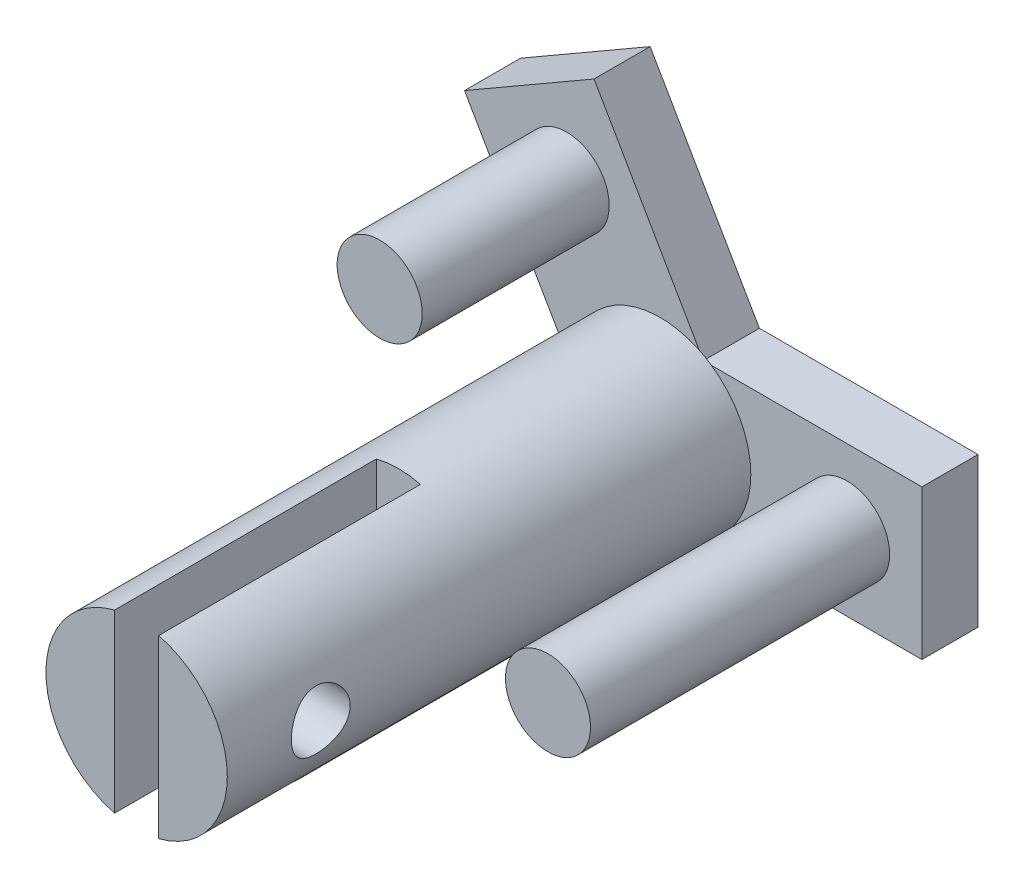
ISO-10303-21;
HEADER;
FILE_DESCRIPTION(('STEP AP214'),'2;1');
FILE_NAME('part.step','',(''),(''),'','','');
FILE_SCHEMA(('AUTOMOTIVE_DESIGN { 1 0 10303 214 1 1 1 1 }'));
ENDSEC;
DATA;
#1=APPLICATION_CONTEXT('core data for automotive mechanical design processes');
#2=APPLICATION_PROTOCOL_DEFINITION('international standard','automotive_design',2000,#1);
#3=PRODUCT_CONTEXT('',#1,'mechanical');
#4=PRODUCT('Part','Part','',(#3));
#5=PRODUCT_RELATED_PRODUCT_CATEGORY('part','',(#4));
#6=PRODUCT_DEFINITION_FORMATION('','',#4);
#7=PRODUCT_DEFINITION_CONTEXT('part definition',#1,'design');
#8=PRODUCT_DEFINITION('design','',#6,#7);
#9=PRODUCT_DEFINITION_SHAPE('','',#8);
#10=(LENGTH_UNIT() NAMED_UNIT(*) SI_UNIT(.MILLI.,.METRE.));
#11=(NAMED_UNIT(*) PLANE_ANGLE_UNIT() SI_UNIT($,.RADIAN.));
#12=(NAMED_UNIT(*) SI_UNIT($,.STERADIAN.) SOLID_ANGLE_UNIT());
#13=UNCERTAINTY_MEASURE_WITH_UNIT(LENGTH_MEASURE(1.E-05),#10,'distance_accuracy_value','');
#14=(GEOMETRIC_REPRESENTATION_CONTEXT(3) GLOBAL_UNCERTAINTY_ASSIGNED_CONTEXT((#13)) GLOBAL_UNIT_ASSIGNED_CONTEXT((#10,
#11,#12)) REPRESENTATION_CONTEXT('',''));
#15=CARTESIAN_POINT('',(0.,0.,0.));
#16=DIRECTION('',(0.,0.,1.));
#17=DIRECTION('',(1.,0.,0.));
#18=AXIS2_PLACEMENT_3D('',#15,#16,#17);
#19=CARTESIAN_POINT('',(-4.99999999999996,8.66025403784441,16.));
#20=DIRECTION('',(0.,0.,-1.));
#21=DIRECTION('',(-1.,0.,0.));
#22=AXIS2_PLACEMENT_3D('',#19,#20,#21);
#23=CYLINDRICAL_SURFACE('',#22,2.275);
#24=CARTESIAN_POINT('',(-4.99999999999996,8.66025403784441,0.));
#25=DIRECTION('',(0.,0.,1.));
#26=DIRECTION('',(1.,0.,0.));
#27=AXIS2_PLACEMENT_3D('',#24,#25,#26);
#28=CIRCLE('',#27,2.275);
#29=CARTESIAN_POINT('',(-2.72499999999996,8.66025403784441,0.));
#30=VERTEX_POINT('',#29);
#31=EDGE_CURVE('E474',#30,#30,#28,.T.);
#32=ORIENTED_EDGE('',*,*,#31,.T.);
#33=EDGE_LOOP('',(#32));
#34=FACE_BOUND('',#33,.T.);
#35=CARTESIAN_POINT('',(-4.99999999999996,8.66025403784441,10.));
#36=DIRECTION('',(0.,0.,1.));
#37=DIRECTION('',(1.,0.,0.));
#38=AXIS2_PLACEMENT_3D('',#35,#36,#37);
#39=CIRCLE('',#38,2.275);
#40=CARTESIAN_POINT('',(-2.72499999999995,8.66025403784441,10.));
#41=VERTEX_POINT('',#40);
#42=EDGE_CURVE('E461',#41,#41,#39,.T.);
#43=ORIENTED_EDGE('',*,*,#42,.F.);
#44=EDGE_LOOP('',(#43));
#45=FACE_BOUND('',#44,.T.);
#46=ADVANCED_FACE('F33',(#34,#45),#23,.T.);
#47=CARTESIAN_POINT('',(0.,0.,0.));
#48=DIRECTION('',(0.,0.,1.));
#49=DIRECTION('',(1.,0.,0.));
#50=AXIS2_PLACEMENT_3D('',#47,#48,#49);
#51=PLANE('',#50);
#52=CARTESIAN_POINT('',(0.,0.,0.));
#53=DIRECTION('',(0.,0.,1.));
#54=DIRECTION('',(1.,0.,0.));
#55=AXIS2_PLACEMENT_3D('',#52,#53,#54);
#56=CIRCLE('',#55,4.85);
#57=CARTESIAN_POINT('',(2.74271763038052,-3.99999999999998,0.));
#58=VERTEX_POINT('',#57);
#59=CARTESIAN_POINT('',(2.74271763038047,4.00000000000002,0.));
#60=VERTEX_POINT('',#59);
#61=EDGE_CURVE('E542',#58,#60,#56,.T.);
#62=ORIENTED_EDGE('',*,*,#61,.F.);
#63=DIRECTION('',(-1.,0.,0.));
#64=VECTOR('',#63,1.);
#65=CARTESIAN_POINT('',(2.30940107675848,-3.99999999999998,0.));
#66=LINE('',#65,#64);
#67=CARTESIAN_POINT('',(14.,-3.99999999999998,0.));
#68=VERTEX_POINT('',#67);
#69=EDGE_CURVE('E45',#68,#58,#66,.T.);
#70=ORIENTED_EDGE('',*,*,#69,.F.);
#71=DIRECTION('',(0.,-1.,0.));
#72=VECTOR('',#71,1.);
#73=CARTESIAN_POINT('',(14.,-3.99999999999998,0.));
#74=LINE('',#73,#72);
#75=CARTESIAN_POINT('',(14.,4.00000000000002,0.));
#76=VERTEX_POINT('',#75);
#77=EDGE_CURVE('E503',#76,#68,#74,.T.);
#78=ORIENTED_EDGE('',*,*,#77,.F.);
#79=DIRECTION('',(1.,0.,0.));
#80=VECTOR('',#79,1.);
#81=CARTESIAN_POINT('',(14.,4.00000000000002,0.));
#82=LINE('',#81,#80);
#83=EDGE_CURVE('E501',#60,#76,#82,.T.);
#84=ORIENTED_EDGE('',*,*,#83,.F.);
#85=EDGE_LOOP('',(#62,#70,#78,#84));
#86=FACE_BOUND('',#85,.T.);
#87=CARTESIAN_POINT('',(10.,0.,0.));
#88=DIRECTION('',(0.,0.,1.));
#89=DIRECTION('',(1.,0.,0.));
#90=AXIS2_PLACEMENT_3D('',#87,#88,#89);
#91=CIRCLE('',#90,2.275);
#92=CARTESIAN_POINT('',(12.275,0.,0.));
#93=VERTEX_POINT('',#92);
#94=EDGE_CURVE('E462',#93,#93,#91,.T.);
#95=ORIENTED_EDGE('',*,*,#94,.F.);
#96=EDGE_LOOP('',(#95));
#97=FACE_BOUND('',#96,.T.);
#98=ADVANCED_FACE('F232',(#86,#97),#51,.T.);
#99=CARTESIAN_POINT('',(-4.835460430328,-0.375263143317036,0.));
#100=VERTEX_POINT('',#99);
#101=CARTESIAN_POINT('',(2.09274279994746,-4.37526314331699,0.));
#102=VERTEX_POINT('',#101);
#103=EDGE_CURVE('E543',#100,#102,#56,.T.);
#104=ORIENTED_EDGE('',*,*,#103,.F.);
#105=DIRECTION('',(0.500000000000004,0.866025403784436,0.));
#106=VECTOR('',#105,1.);
#107=CARTESIAN_POINT('',(-4.61880215351696,0.,0.));
#108=LINE('',#107,#106);
#109=CARTESIAN_POINT('',(-10.4641016151378,-10.1243556529821,0.));
#110=VERTEX_POINT('',#109);
#111=EDGE_CURVE('E477',#110,#100,#108,.T.);
#112=ORIENTED_EDGE('',*,*,#111,.F.);
#113=DIRECTION('',(-0.866025403784438,0.500000000000001,0.));
#114=VECTOR('',#113,1.);
#115=CARTESIAN_POINT('',(-10.4641016151378,-10.1243556529821,0.));
#116=LINE('',#115,#114);
#117=CARTESIAN_POINT('',(-3.53589838486226,-14.1243556529821,0.));
#118=VERTEX_POINT('',#117);
#119=EDGE_CURVE('E170',#118,#110,#116,.T.);
#120=ORIENTED_EDGE('',*,*,#119,.F.);
#121=DIRECTION('',(-0.499999999999999,-0.866025403784439,0.));
#122=VECTOR('',#121,1.);
#123=CARTESIAN_POINT('',(-3.53589838486226,-14.1243556529821,0.));
#124=LINE('',#123,#122);
#125=EDGE_CURVE('E506',#102,#118,#124,.T.);
#126=ORIENTED_EDGE('',*,*,#125,.F.);
#127=EDGE_LOOP('',(#104,#112,#120,#126));
#128=FACE_BOUND('',#127,.T.);
#129=CARTESIAN_POINT('',(-5.00000000000001,-8.66025403784438,0.));
#130=DIRECTION('',(0.,0.,1.));
#131=DIRECTION('',(1.,0.,0.));
#132=AXIS2_PLACEMENT_3D('',#129,#130,#131);
#133=CIRCLE('',#132,2.275);
#134=CARTESIAN_POINT('',(-2.72500000000001,-8.66025403784438,0.));
#135=VERTEX_POINT('',#134);
#136=EDGE_CURVE('E469',#135,#135,#133,.T.);
#137=ORIENTED_EDGE('',*,*,#136,.F.);
#138=EDGE_LOOP('',(#137));
#139=FACE_BOUND('',#138,.T.);
#140=ADVANCED_FACE('F229',(#128,#139),#51,.T.);
#141=CARTESIAN_POINT('',(2.09274279994757,4.37526314331694,0.));
#142=VERTEX_POINT('',#141);
#143=CARTESIAN_POINT('',(-4.835460430328,0.375263143317045,0.));
#144=VERTEX_POINT('',#143);
#145=EDGE_CURVE('E533',#142,#144,#56,.T.);
#146=ORIENTED_EDGE('',*,*,#145,.F.);
#147=DIRECTION('',(0.499999999999997,-0.86602540378444,0.));
#148=VECTOR('',#147,1.);
#149=CARTESIAN_POINT('',(2.30940107675854,4.00000000000002,0.));
#150=LINE('',#149,#148);
#151=CARTESIAN_POINT('',(-3.53589838486217,14.1243556529822,0.));
#152=VERTEX_POINT('',#151);
#153=EDGE_CURVE('E498',#152,#142,#150,.T.);
#154=ORIENTED_EDGE('',*,*,#153,.F.);
#155=DIRECTION('',(0.866025403784442,0.499999999999994,0.));
#156=VECTOR('',#155,1.);
#157=CARTESIAN_POINT('',(-3.53589838486217,14.1243556529822,0.));
#158=LINE('',#157,#156);
#159=CARTESIAN_POINT('',(-10.4641016151377,10.1243556529822,0.));
#160=VERTEX_POINT('',#159);
#161=EDGE_CURVE('E496',#160,#152,#158,.T.);
#162=ORIENTED_EDGE('',*,*,#161,.F.);
#163=DIRECTION('',(-0.499999999999998,0.86602540378444,0.));
#164=VECTOR('',#163,1.);
#165=CARTESIAN_POINT('',(-10.4641016151377,10.1243556529822,0.));
#166=LINE('',#165,#164);
#167=EDGE_CURVE('E493',#144,#160,#166,.T.);
#168=ORIENTED_EDGE('',*,*,#167,.F.);
#169=EDGE_LOOP('',(#146,#154,#162,#168));
#170=FACE_BOUND('',#169,.T.);
#171=ORIENTED_EDGE('',*,*,#31,.F.);
#172=EDGE_LOOP('',(#171));
#173=FACE_BOUND('',#172,.T.);
#174=ADVANCED_FACE('F223',(#170,#173),#51,.T.);
#175=CARTESIAN_POINT('',(0.,0.,0.));
#176=DIRECTION('',(0.,0.,1.));
#177=DIRECTION('',(1.,0.,0.));
#178=AXIS2_PLACEMENT_3D('',#175,#176,#177);
#179=PLANE('',#178);
#180=CARTESIAN_POINT('',(2.30940107675848,-3.99999999999998,0.));
#181=VERTEX_POINT('',#180);
#182=EDGE_CURVE('E52',#181,#102,#124,.T.);
#183=ORIENTED_EDGE('',*,*,#182,.F.);
#184=EDGE_CURVE('E11',#58,#181,#66,.T.);
#185=ORIENTED_EDGE('',*,*,#184,.F.);
#186=EDGE_CURVE('E577',#102,#58,#56,.T.);
#187=ORIENTED_EDGE('',*,*,#186,.F.);
#188=EDGE_LOOP('',(#183,#185,#187));
#189=FACE_BOUND('',#188,.T.);
#190=ADVANCED_FACE('F220',(#189),#179,.F.);
#191=CARTESIAN_POINT('',(2.30940107675854,4.00000000000002,0.));
#192=VERTEX_POINT('',#191);
#193=EDGE_CURVE('E59',#192,#60,#82,.T.);
#194=ORIENTED_EDGE('',*,*,#193,.F.);
#195=EDGE_CURVE('E43',#142,#192,#150,.T.);
#196=ORIENTED_EDGE('',*,*,#195,.F.);
#197=EDGE_CURVE('E538',#60,#142,#56,.T.);
#198=ORIENTED_EDGE('',*,*,#197,.F.);
#199=EDGE_LOOP('',(#194,#196,#198));
#200=FACE_BOUND('',#199,.T.);
#201=ADVANCED_FACE('F222',(#200),#179,.F.);
#202=CARTESIAN_POINT('',(-4.61880215351696,0.,0.));
#203=VERTEX_POINT('',#202);
#204=EDGE_CURVE('E175',#100,#203,#108,.T.);
#205=ORIENTED_EDGE('',*,*,#204,.F.);
#206=EDGE_CURVE('E539',#144,#100,#56,.T.);
#207=ORIENTED_EDGE('',*,*,#206,.F.);
#208=EDGE_CURVE('E494',#203,#144,#166,.T.);
#209=ORIENTED_EDGE('',*,*,#208,.F.);
#210=EDGE_LOOP('',(#205,#207,#209));
#211=FACE_BOUND('',#210,.T.);
#212=ADVANCED_FACE('F224',(#211),#179,.F.);
#213=CARTESIAN_POINT('',(0.,0.,28.));
#214=DIRECTION('',(0.,0.,1.));
#215=DIRECTION('',(1.,0.,0.));
#216=AXIS2_PLACEMENT_3D('',#213,#214,#215);
#217=PLANE('',#216);
#218=DIRECTION('',(0.,1.,0.));
#219=VECTOR('',#218,1.);
#220=CARTESIAN_POINT('',(1.18,0.,28.));
#221=LINE('',#220,#219);
#222=CARTESIAN_POINT('',(1.18,-4.70426402320278,28.));
#223=VERTEX_POINT('',#222);
#224=CARTESIAN_POINT('',(1.18,4.70426402320278,28.));
#225=VERTEX_POINT('',#224);
#226=EDGE_CURVE('E549',#223,#225,#221,.T.);
#227=ORIENTED_EDGE('',*,*,#226,.F.);
#228=CARTESIAN_POINT('',(0.,0.,28.));
#229=DIRECTION('',(0.,0.,1.));
#230=DIRECTION('',(1.,0.,0.));
#231=AXIS2_PLACEMENT_3D('',#228,#229,#230);
#232=CIRCLE('',#231,4.85);
#233=EDGE_CURVE('E541',#223,#225,#232,.T.);
#234=ORIENTED_EDGE('',*,*,#233,.T.);
#235=EDGE_LOOP('',(#227,#234));
#236=FACE_BOUND('',#235,.T.);
#237=ADVANCED_FACE('F219',(#236),#217,.T.);
#238=CARTESIAN_POINT('',(0.,0.,28.));
#239=DIRECTION('',(0.,0.,-1.));
#240=DIRECTION('',(-1.,0.,0.));
#241=AXIS2_PLACEMENT_3D('',#238,#239,#240);
#242=CYLINDRICAL_SURFACE('',#241,4.85);
#243=CARTESIAN_POINT('',(4.85,0.,24.575));
#244=CARTESIAN_POINT('',(4.84999993999274,0.0860613830732849,24.5749999776443));
#245=CARTESIAN_POINT('',(4.84768797692763,0.172123855143719,24.567923054505));
#246=CARTESIAN_POINT('',(4.83869231009479,0.341721391598793,24.5398837385932));
#247=CARTESIAN_POINT('',(4.83200793016766,0.425256062988472,24.5189191982052));
#248=CARTESIAN_POINT('',(4.81499538643767,0.587328257188695,24.4638937369173));
#249=CARTESIAN_POINT('',(4.80467312842366,0.665873637216033,24.4298540344379));
#250=CARTESIAN_POINT('',(4.78144351151116,0.816141129596984,24.3497380637625));
#251=CARTESIAN_POINT('',(4.76853568447428,0.88786200284424,24.3036596153928));
#252=CARTESIAN_POINT('',(4.74102082057978,1.02481663295395,24.1991721471742));
#253=CARTESIAN_POINT('',(4.72637460295703,1.08979330196185,24.1404365238626));
#254=CARTESIAN_POINT('',(4.69725394763857,1.20916840795528,24.0129967946378));
#255=CARTESIAN_POINT('',(4.6827795458182,1.26356467099234,23.9442906451407));
#256=CARTESIAN_POINT('',(4.65521478332178,1.36167134861424,23.7965830616877));
#257=CARTESIAN_POINT('',(4.64217242957024,1.40505304964245,23.7173534805874));
#258=CARTESIAN_POINT('',(4.61954150583434,1.47776761507159,23.5522311044256));
#259=CARTESIAN_POINT('',(4.60995194305992,1.50710451861101,23.4663402333492));
#260=CARTESIAN_POINT('',(4.59572378237627,1.54994220106585,23.2932477660089));
#261=CARTESIAN_POINT('',(4.59093563203985,1.5639227243312,23.2061775473738));
#262=CARTESIAN_POINT('',(4.5864093591984,1.57715016707346,23.0308057720108));
#263=CARTESIAN_POINT('',(4.58666976921012,1.57640136797477,22.9425045805515));
#264=CARTESIAN_POINT('',(4.59207973567197,1.56056505311718,22.7712165484113));
#265=CARTESIAN_POINT('',(4.5970181630397,1.54609670160351,22.688164652457));
#266=CARTESIAN_POINT('',(4.61088329862707,1.50423945830718,22.5257378268348));
#267=CARTESIAN_POINT('',(4.61981046170313,1.47684909293972,22.4463633176583));
#268=CARTESIAN_POINT('',(4.64080236845623,1.40950675560717,22.292109174518));
#269=CARTESIAN_POINT('',(4.65291357569265,1.36936675830616,22.2173182220431));
#270=CARTESIAN_POINT('',(4.67888871441245,1.27779512119796,22.075334717169));
#271=CARTESIAN_POINT('',(4.69275313072169,1.2263603550687,22.0081442763616));
#272=CARTESIAN_POINT('',(4.72151002193061,1.11065843317809,21.8797808358616));
#273=CARTESIAN_POINT('',(4.73641945334077,1.04588298072314,21.8190688968181));
#274=CARTESIAN_POINT('',(4.76498542284939,0.906885663486573,21.7092526001727));
#275=CARTESIAN_POINT('',(4.7786418526477,0.83266298347777,21.6601492453535));
#276=CARTESIAN_POINT('',(4.803326836521,0.675937820633178,21.5745977479569));
#277=CARTESIAN_POINT('',(4.81433064352115,0.59336685571924,21.5382674326535));
#278=CARTESIAN_POINT('',(4.83229137819121,0.422843546115297,21.4801530491372));
#279=CARTESIAN_POINT('',(4.83924963702044,0.334892982084287,21.4583641958087));
#280=CARTESIAN_POINT('',(4.84811739218595,0.160014628798588,21.4307548483723));
#281=CARTESIAN_POINT('',(4.85022389972505,0.0731951265461602,21.4243108671587));
#282=CARTESIAN_POINT('',(4.84973823502258,-0.100298367270868,21.4258057357654));
#283=CARTESIAN_POINT('',(4.84714681059966,-0.186972379796403,21.4337422964854));
#284=CARTESIAN_POINT('',(4.83768628536478,-0.355257122864095,21.4632764740525));
#285=CARTESIAN_POINT('',(4.83093555837613,-0.436941457905801,21.4844963073738));
#286=CARTESIAN_POINT('',(4.81395617506734,-0.595562029954689,21.5395271221112));
#287=CARTESIAN_POINT('',(4.8037270802259,-0.672497666843099,21.5733396911574));
#288=CARTESIAN_POINT('',(4.78051007756817,-0.821624808160351,21.6535568773611));
#289=CARTESIAN_POINT('',(4.7674583913642,-0.893644999213463,21.7002609943806));
#290=CARTESIAN_POINT('',(4.74008153594588,-1.02903139988972,21.8045806004787));
#291=CARTESIAN_POINT('',(4.72575599632549,-1.09239507873259,21.8621992687882));
#292=CARTESIAN_POINT('',(4.69666751099177,-1.21150212548531,21.989645482941));
#293=CARTESIAN_POINT('',(4.68191224212086,-1.2668007036518,22.059891449696));
#294=CARTESIAN_POINT('',(4.65426950941093,-1.36487372585819,22.2089847254226));
#295=CARTESIAN_POINT('',(4.64138204034608,-1.40764820493901,22.2878320103278));
#296=CARTESIAN_POINT('',(4.61906826935161,-1.47922900451393,22.4518346750047));
#297=CARTESIAN_POINT('',(4.60963204334892,-1.50807545296881,22.5369711080406));
#298=CARTESIAN_POINT('',(4.59540168033587,-1.55090381098164,22.7112670487786));
#299=CARTESIAN_POINT('',(4.59060559112895,-1.56489197195528,22.8004248480746));
#300=CARTESIAN_POINT('',(4.58641285352548,-1.57713489362434,22.9755524697769));
#301=CARTESIAN_POINT('',(4.58676409728518,-1.57612423930785,23.061465500431));
#302=CARTESIAN_POINT('',(4.59220767559651,-1.5601916237418,23.2318309490479));
#303=CARTESIAN_POINT('',(4.59729975459124,-1.54527041234714,23.3162834454915));
#304=CARTESIAN_POINT('',(4.61146827360902,-1.50244870799193,23.4799013003918));
#305=CARTESIAN_POINT('',(4.62047511429538,-1.47477445180604,23.5591323613381));
#306=CARTESIAN_POINT('',(4.64143583559968,-1.40741318232295,23.7118886625843));
#307=CARTESIAN_POINT('',(4.65339034841661,-1.36772359163263,23.785412674417));
#308=CARTESIAN_POINT('',(4.67952224619182,-1.27552172426177,23.9279951177299));
#309=CARTESIAN_POINT('',(4.69377162874972,-1.22254304774947,23.9967386930898));
#310=CARTESIAN_POINT('',(4.72257410449796,-1.10606877673219,24.1245974359869));
#311=CARTESIAN_POINT('',(4.73712728059645,-1.04257027758586,24.1837099353097));
#312=CARTESIAN_POINT('',(4.76553109164182,-0.904090865217836,24.292783562664));
#313=CARTESIAN_POINT('',(4.77933709982762,-0.828777015184565,24.3423350018328));
#314=CARTESIAN_POINT('',(4.80410375188532,-0.670443266342961,24.4280148950541));
#315=CARTESIAN_POINT('',(4.81506529011746,-0.587425800883457,24.4641475697883));
#316=CARTESIAN_POINT('',(4.83234360342133,-0.421300936722196,24.5199772792117));
#317=CARTESIAN_POINT('',(4.83890433663051,-0.338512326358257,24.5405475862505));
#318=CARTESIAN_POINT('',(4.8477320423946,-0.170482432278024,24.5680572998041));
#319=CARTESIAN_POINT('',(4.85000005943576,-0.085241750315566,24.5750000221428));
#320=CARTESIAN_POINT('',(4.85,0.,24.575));
#321=B_SPLINE_CURVE_WITH_KNOTS('',3,(#243,#244,#245,#246,#247,#248,#249,#250,#251,#252,#253,
#254,#255,#256,#257,#258,#259,#260,#261,#262,#263,#264,#265,#266,#267,#268,#269,#270,#271,#272,
#273,#274,#275,#276,#277,#278,#279,#280,#281,#282,#283,#284,#285,#286,#287,#288,#289,#290,#291,
#292,#293,#294,#295,#296,#297,#298,#299,#300,#301,#302,#303,#304,#305,#306,#307,#308,#309,#310,
#311,#312,#313,#314,#315,#316,#317,#318,#319,#320),.UNSPECIFIED.,.T.,.F.,(4,2,2,2,2,2,2,2,2,2,2,
2,2,2,2,2,2,2,2,2,2,2,2,2,2,2,2,2,2,2,2,2,2,2,2,2,2,2,4),(0.,0.257870616986795,
0.515781121038953,0.773274843254618,1.03081522902019,1.29603225139865,1.5613037102967,
1.83374802682579,2.1061139440496,2.36970501483799,2.63321946780711,2.88538057201253,
3.13757043881046,3.39366711628082,3.64983476927684,3.91865366703719,4.18749577766434,
4.45875653384938,4.72992798299201,4.98987786843661,5.24978637858893,5.50261927256906,
5.7554840532694,6.0148059440487,6.27420348754539,6.54475427059145,6.81530429666181,
7.08507012136517,7.35472240087616,7.61121364063929,7.86769105492499,8.11978407535021,
8.37193121027123,8.63461169729193,8.89736483459948,9.16964813319629,9.44184571626815,
9.69732259059516,9.95273729533202),.UNSPECIFIED.);
#322=CARTESIAN_POINT('',(4.85,0.,24.575));
#323=VERTEX_POINT('',#322);
#324=EDGE_CURVE('E191',#323,#323,#321,.T.);
#325=ORIENTED_EDGE('',*,*,#324,.T.);
#326=EDGE_LOOP('',(#325));
#327=FACE_BOUND('',#326,.T.);
#328=CARTESIAN_POINT('',(-4.85,0.,24.575));
#329=CARTESIAN_POINT('',(-4.84999993999274,-0.0860613830732856,24.5749999776443));
#330=CARTESIAN_POINT('',(-4.84768797692763,-0.17212385514372,24.567923054505));
#331=CARTESIAN_POINT('',(-4.83869231009479,-0.341721391598794,24.5398837385932));
#332=CARTESIAN_POINT('',(-4.83200793016766,-0.425256062988473,24.5189191982052));
#333=CARTESIAN_POINT('',(-4.81499538643767,-0.587328257188696,24.4638937369173));
#334=CARTESIAN_POINT('',(-4.80467312842366,-0.665873637216034,24.4298540344379));
#335=CARTESIAN_POINT('',(-4.78144351151116,-0.816141129596986,24.3497380637625));
#336=CARTESIAN_POINT('',(-4.76853568447428,-0.887862002844242,24.3036596153928));
#337=CARTESIAN_POINT('',(-4.74102082057978,-1.02481663295395,24.1991721471742));
#338=CARTESIAN_POINT('',(-4.72637460295703,-1.08979330196185,24.1404365238626));
#339=CARTESIAN_POINT('',(-4.69725394763857,-1.20916840795528,24.0129967946378));
#340=CARTESIAN_POINT('',(-4.6827795458182,-1.26356467099235,23.9442906451407));
#341=CARTESIAN_POINT('',(-4.65521478332178,-1.36167134861424,23.7965830616877));
#342=CARTESIAN_POINT('',(-4.64217242957024,-1.40505304964245,23.7173534805874));
#343=CARTESIAN_POINT('',(-4.61954150583434,-1.47776761507159,23.5522311044256));
#344=CARTESIAN_POINT('',(-4.60995194305992,-1.50710451861102,23.4663402333492));
#345=CARTESIAN_POINT('',(-4.59572378237627,-1.54994220106585,23.2932477660089));
#346=CARTESIAN_POINT('',(-4.59093563203984,-1.5639227243312,23.2061775473738));
#347=CARTESIAN_POINT('',(-4.5864093591984,-1.57715016707346,23.0308057720108));
#348=CARTESIAN_POINT('',(-4.58666976921012,-1.57640136797477,22.9425045805516));
#349=CARTESIAN_POINT('',(-4.59207973567197,-1.56056505311718,22.7712165484113));
#350=CARTESIAN_POINT('',(-4.5970181630397,-1.54609670160351,22.688164652457));
#351=CARTESIAN_POINT('',(-4.61088329862707,-1.50423945830718,22.5257378268348));
#352=CARTESIAN_POINT('',(-4.61981046170313,-1.47684909293972,22.4463633176583));
#353=CARTESIAN_POINT('',(-4.64080236845623,-1.40950675560717,22.292109174518));
#354=CARTESIAN_POINT('',(-4.65291357569265,-1.36936675830616,22.2173182220431));
#355=CARTESIAN_POINT('',(-4.67888871441245,-1.27779512119796,22.075334717169));
#356=CARTESIAN_POINT('',(-4.69275313072169,-1.2263603550687,22.0081442763617));
#357=CARTESIAN_POINT('',(-4.72151002193061,-1.11065843317809,21.8797808358616));
#358=CARTESIAN_POINT('',(-4.73641945334077,-1.04588298072315,21.8190688968181));
#359=CARTESIAN_POINT('',(-4.76498542284939,-0.906885663486577,21.7092526001727));
#360=CARTESIAN_POINT('',(-4.7786418526477,-0.832662983477775,21.6601492453535));
#361=CARTESIAN_POINT('',(-4.80332683652099,-0.675937820633183,21.5745977479569));
#362=CARTESIAN_POINT('',(-4.81433064352115,-0.593366855719244,21.5382674326535));
#363=CARTESIAN_POINT('',(-4.83229137819122,-0.4228435461153,21.4801530491372));
#364=CARTESIAN_POINT('',(-4.83924963702044,-0.33489298208429,21.4583641958087));
#365=CARTESIAN_POINT('',(-4.84811739218595,-0.16001462879859,21.4307548483723));
#366=CARTESIAN_POINT('',(-4.85022389972505,-0.0731951265461626,21.4243108671587));
#367=CARTESIAN_POINT('',(-4.84973823502258,0.100298367270866,21.4258057357654));
#368=CARTESIAN_POINT('',(-4.84714681059966,0.1869723797964,21.4337422964854));
#369=CARTESIAN_POINT('',(-4.83768628536478,0.355257122864093,21.4632764740525));
#370=CARTESIAN_POINT('',(-4.83093555837613,0.436941457905799,21.4844963073738));
#371=CARTESIAN_POINT('',(-4.81395617506734,0.595562029954686,21.5395271221112));
#372=CARTESIAN_POINT('',(-4.8037270802259,0.672497666843097,21.5733396911574));
#373=CARTESIAN_POINT('',(-4.78051007756817,0.821624808160349,21.6535568773611));
#374=CARTESIAN_POINT('',(-4.7674583913642,0.893644999213462,21.7002609943806));
#375=CARTESIAN_POINT('',(-4.74008153594588,1.02903139988972,21.8045806004787));
#376=CARTESIAN_POINT('',(-4.72575599632549,1.09239507873259,21.8621992687882));
#377=CARTESIAN_POINT('',(-4.69666751099177,1.21150212548531,21.989645482941));
#378=CARTESIAN_POINT('',(-4.68191224212086,1.2668007036518,22.059891449696));
#379=CARTESIAN_POINT('',(-4.65426950941093,1.36487372585819,22.2089847254226));
#380=CARTESIAN_POINT('',(-4.64138204034608,1.40764820493901,22.2878320103278));
#381=CARTESIAN_POINT('',(-4.61906826935161,1.47922900451393,22.4518346750047));
#382=CARTESIAN_POINT('',(-4.60963204334892,1.50807545296881,22.5369711080406));
#383=CARTESIAN_POINT('',(-4.59540168033587,1.55090381098163,22.7112670487786));
#384=CARTESIAN_POINT('',(-4.59060559112895,1.56489197195528,22.8004248480746));
#385=CARTESIAN_POINT('',(-4.58641285352548,1.57713489362434,22.9755524697769));
#386=CARTESIAN_POINT('',(-4.58676409728518,1.57612423930785,23.061465500431));
#387=CARTESIAN_POINT('',(-4.59220767559651,1.56019162374179,23.2318309490479));
#388=CARTESIAN_POINT('',(-4.59729975459124,1.54527041234713,23.3162834454915));
#389=CARTESIAN_POINT('',(-4.61146827360902,1.50244870799193,23.4799013003918));
#390=CARTESIAN_POINT('',(-4.62047511429538,1.47477445180603,23.5591323613381));
#391=CARTESIAN_POINT('',(-4.64143583559968,1.40741318232295,23.7118886625843));
#392=CARTESIAN_POINT('',(-4.65339034841661,1.36772359163262,23.785412674417));
#393=CARTESIAN_POINT('',(-4.67952224619182,1.27552172426177,23.9279951177299));
#394=CARTESIAN_POINT('',(-4.69377162874972,1.22254304774947,23.9967386930898));
#395=CARTESIAN_POINT('',(-4.72257410449796,1.10606877673219,24.1245974359869));
#396=CARTESIAN_POINT('',(-4.73712728059645,1.04257027758586,24.1837099353097));
#397=CARTESIAN_POINT('',(-4.76553109164182,0.904090865217834,24.292783562664));
#398=CARTESIAN_POINT('',(-4.77933709982763,0.828777015184563,24.3423350018328));
#399=CARTESIAN_POINT('',(-4.80410375188532,0.67044326634296,24.4280148950541));
#400=CARTESIAN_POINT('',(-4.81506529011746,0.587425800883456,24.4641475697883));
#401=CARTESIAN_POINT('',(-4.83234360342133,0.421300936722194,24.5199772792117));
#402=CARTESIAN_POINT('',(-4.83890433663051,0.338512326358255,24.5405475862505));
#403=CARTESIAN_POINT('',(-4.8477320423946,0.170482432278022,24.5680572998041));
#404=CARTESIAN_POINT('',(-4.85000005943576,0.0852417503155648,24.5750000221428));
#405=CARTESIAN_POINT('',(-4.85,0.,24.575));
#406=B_SPLINE_CURVE_WITH_KNOTS('',3,(#328,#329,#330,#331,#332,#333,#334,#335,#336,#337,#338,
#339,#340,#341,#342,#343,#344,#345,#346,#347,#348,#349,#350,#351,#352,#353,#354,#355,#356,#357,
#358,#359,#360,#361,#362,#363,#364,#365,#366,#367,#368,#369,#370,#371,#372,#373,#374,#375,#376,
#377,#378,#379,#380,#381,#382,#383,#384,#385,#386,#387,#388,#389,#390,#391,#392,#393,#394,#395,
#396,#397,#398,#399,#400,#401,#402,#403,#404,#405),.UNSPECIFIED.,.T.,.F.,(4,2,2,2,2,2,2,2,2,2,2,
2,2,2,2,2,2,2,2,2,2,2,2,2,2,2,2,2,2,2,2,2,2,2,2,2,2,2,4),(0.,0.257870616986795,
0.515781121038953,0.773274843254619,1.03081522902019,1.29603225139865,1.5613037102967,
1.83374802682578,2.1061139440496,2.36970501483799,2.63321946780711,2.88538057201253,
3.13757043881046,3.39366711628082,3.64983476927684,3.91865366703718,4.18749577766434,
4.45875653384938,4.72992798299201,4.98987786843661,5.24978637858893,5.50261927256906,
5.7554840532694,6.01480594404871,6.27420348754539,6.54475427059145,6.81530429666181,
7.08507012136517,7.35472240087616,7.61121364063929,7.86769105492499,8.11978407535021,
8.37193121027123,8.63461169729193,8.89736483459948,9.16964813319629,9.44184571626815,
9.69732259059516,9.95273729533202),.UNSPECIFIED.);
#407=CARTESIAN_POINT('',(-4.85,0.,24.575));
#408=VERTEX_POINT('',#407);
#409=EDGE_CURVE('E185',#408,#408,#406,.T.);
#410=ORIENTED_EDGE('',*,*,#409,.T.);
#411=EDGE_LOOP('',(#410));
#412=FACE_BOUND('',#411,.T.);
#413=CARTESIAN_POINT('',(0.,0.,14.));
#414=DIRECTION('',(0.,0.,-1.));
#415=DIRECTION('',(-1.,0.,0.));
#416=AXIS2_PLACEMENT_3D('',#413,#414,#415);
#417=CIRCLE('',#416,4.85);
#418=CARTESIAN_POINT('',(-1.18,4.70426402320278,14.));
#419=VERTEX_POINT('',#418);
#420=CARTESIAN_POINT('',(1.18,4.70426402320278,14.));
#421=VERTEX_POINT('',#420);
#422=EDGE_CURVE('E553',#419,#421,#417,.T.);
#423=ORIENTED_EDGE('',*,*,#422,.T.);
#424=DIRECTION('',(0.,0.,-1.));
#425=VECTOR('',#424,1.);
#426=CARTESIAN_POINT('',(1.18,4.70426402320278,28.));
#427=LINE('',#426,#425);
#428=EDGE_CURVE('E580',#421,#225,#427,.F.);
#429=ORIENTED_EDGE('',*,*,#428,.T.);
#430=ORIENTED_EDGE('',*,*,#233,.F.);
#431=DIRECTION('',(0.,0.,-1.));
#432=VECTOR('',#431,1.);
#433=CARTESIAN_POINT('',(1.18,-4.70426402320278,28.));
#434=LINE('',#433,#432);
#435=CARTESIAN_POINT('',(1.18,-4.70426402320278,14.));
#436=VERTEX_POINT('',#435);
#437=EDGE_CURVE('E579',#223,#436,#434,.T.);
#438=ORIENTED_EDGE('',*,*,#437,.T.);
#439=CARTESIAN_POINT('',(-1.18,-4.70426402320278,14.));
#440=VERTEX_POINT('',#439);
#441=EDGE_CURVE('E551',#436,#440,#417,.T.);
#442=ORIENTED_EDGE('',*,*,#441,.T.);
#443=DIRECTION('',(0.,0.,-1.));
#444=VECTOR('',#443,1.);
#445=CARTESIAN_POINT('',(-1.18,-4.70426402320278,28.));
#446=LINE('',#445,#444);
#447=CARTESIAN_POINT('',(-1.18,-4.70426402320278,28.));
#448=VERTEX_POINT('',#447);
#449=EDGE_CURVE('E586',#440,#448,#446,.F.);
#450=ORIENTED_EDGE('',*,*,#449,.T.);
#451=CARTESIAN_POINT('',(-1.18,4.70426402320278,28.));
#452=VERTEX_POINT('',#451);
#453=EDGE_CURVE('E550',#452,#448,#232,.T.);
#454=ORIENTED_EDGE('',*,*,#453,.F.);
#455=DIRECTION('',(0.,0.,-1.));
#456=VECTOR('',#455,1.);
#457=CARTESIAN_POINT('',(-1.18,4.70426402320278,28.));
#458=LINE('',#457,#456);
#459=EDGE_CURVE('E582',#452,#419,#458,.T.);
#460=ORIENTED_EDGE('',*,*,#459,.T.);
#461=EDGE_LOOP('',(#423,#429,#430,#438,#442,#450,#454,#460));
#462=FACE_BOUND('',#461,.T.);
#463=ORIENTED_EDGE('',*,*,#197,.T.);
#464=ORIENTED_EDGE('',*,*,#145,.T.);
#465=ORIENTED_EDGE('',*,*,#206,.T.);
#466=ORIENTED_EDGE('',*,*,#103,.T.);
#467=ORIENTED_EDGE('',*,*,#186,.T.);
#468=ORIENTED_EDGE('',*,*,#61,.T.);
#469=EDGE_LOOP('',(#463,#464,#465,#466,#467,#468));
#470=FACE_BOUND('',#469,.T.);
#471=ADVANCED_FACE('F35',(#327,#412,#462,#470),#242,.T.);
#472=DIRECTION('',(0.,-1.,0.));
#473=VECTOR('',#472,1.);
#474=CARTESIAN_POINT('',(-1.18,0.,28.));
#475=LINE('',#474,#473);
#476=EDGE_CURVE('E547',#452,#448,#475,.T.);
#477=ORIENTED_EDGE('',*,*,#476,.F.);
#478=ORIENTED_EDGE('',*,*,#453,.T.);
#479=EDGE_LOOP('',(#477,#478));
#480=FACE_BOUND('',#479,.T.);
#481=ADVANCED_FACE('F208',(#480),#217,.T.);
#482=CARTESIAN_POINT('',(0.,0.,14.));
#483=DIRECTION('',(0.,0.,-1.));
#484=DIRECTION('',(-1.,0.,0.));
#485=AXIS2_PLACEMENT_3D('',#482,#483,#484);
#486=PLANE('',#485);
#487=DIRECTION('',(0.,-1.,0.));
#488=VECTOR('',#487,1.);
#489=CARTESIAN_POINT('',(-1.18,-5.,14.));
#490=LINE('',#489,#488);
#491=EDGE_CURVE('E588',#419,#440,#490,.T.);
#492=ORIENTED_EDGE('',*,*,#491,.T.);
#493=ORIENTED_EDGE('',*,*,#441,.F.);
#494=DIRECTION('',(0.,1.,0.));
#495=VECTOR('',#494,1.);
#496=CARTESIAN_POINT('',(1.18,-5.,14.));
#497=LINE('',#496,#495);
#498=EDGE_CURVE('E590',#436,#421,#497,.T.);
#499=ORIENTED_EDGE('',*,*,#498,.T.);
#500=ORIENTED_EDGE('',*,*,#422,.F.);
#501=EDGE_LOOP('',(#492,#493,#499,#500));
#502=FACE_BOUND('',#501,.T.);
#503=ADVANCED_FACE('F203',(#502),#486,.F.);
#504=CARTESIAN_POINT('',(1.18,-5.,14.));
#505=DIRECTION('',(1.,0.,0.));
#506=DIRECTION('',(0.,0.,-1.));
#507=AXIS2_PLACEMENT_3D('',#504,#505,#506);
#508=PLANE('',#507);
#509=CARTESIAN_POINT('',(1.18,0.,23.));
#510=DIRECTION('',(1.,0.,0.));
#511=DIRECTION('',(0.,0.,-1.));
#512=AXIS2_PLACEMENT_3D('',#509,#510,#511);
#513=CIRCLE('',#512,1.575);
#514=CARTESIAN_POINT('',(1.18,0.,21.425));
#515=VERTEX_POINT('',#514);
#516=EDGE_CURVE('E178',#515,#515,#513,.T.);
#517=ORIENTED_EDGE('',*,*,#516,.T.);
#518=EDGE_LOOP('',(#517));
#519=FACE_BOUND('',#518,.T.);
#520=ORIENTED_EDGE('',*,*,#226,.T.);
#521=ORIENTED_EDGE('',*,*,#428,.F.);
#522=ORIENTED_EDGE('',*,*,#498,.F.);
#523=ORIENTED_EDGE('',*,*,#437,.F.);
#524=EDGE_LOOP('',(#520,#521,#522,#523));
#525=FACE_BOUND('',#524,.T.);
#526=ADVANCED_FACE('F207',(#519,#525),#508,.F.);
#527=CARTESIAN_POINT('',(-1.18,-5.,14.));
#528=DIRECTION('',(-1.,0.,0.));
#529=DIRECTION('',(0.,0.,1.));
#530=AXIS2_PLACEMENT_3D('',#527,#528,#529);
#531=PLANE('',#530);
#532=CARTESIAN_POINT('',(-1.18,0.,23.));
#533=DIRECTION('',(-1.,0.,0.));
#534=DIRECTION('',(0.,0.,1.));
#535=AXIS2_PLACEMENT_3D('',#532,#533,#534);
#536=CIRCLE('',#535,1.575);
#537=CARTESIAN_POINT('',(-1.18,0.,24.575));
#538=VERTEX_POINT('',#537);
#539=EDGE_CURVE('E38',#538,#538,#536,.T.);
#540=ORIENTED_EDGE('',*,*,#539,.T.);
#541=EDGE_LOOP('',(#540));
#542=FACE_BOUND('',#541,.T.);
#543=ORIENTED_EDGE('',*,*,#476,.T.);
#544=ORIENTED_EDGE('',*,*,#449,.F.);
#545=ORIENTED_EDGE('',*,*,#491,.F.);
#546=ORIENTED_EDGE('',*,*,#459,.F.);
#547=EDGE_LOOP('',(#543,#544,#545,#546));
#548=FACE_BOUND('',#547,.T.);
#549=ADVANCED_FACE('F210',(#542,#548),#531,.F.);
#550=CARTESIAN_POINT('',(4.85,0.,23.));
#551=DIRECTION('',(-1.,0.,0.));
#552=DIRECTION('',(0.,0.,1.));
#553=AXIS2_PLACEMENT_3D('',#550,#551,#552);
#554=CYLINDRICAL_SURFACE('',#553,1.575);
#555=ORIENTED_EDGE('',*,*,#539,.F.);
#556=EDGE_LOOP('',(#555));
#557=FACE_BOUND('',#556,.T.);
#558=ORIENTED_EDGE('',*,*,#409,.F.);
#559=EDGE_LOOP('',(#558));
#560=FACE_BOUND('',#559,.T.);
#561=ADVANCED_FACE('F200',(#557,#560),#554,.F.);
#562=ORIENTED_EDGE('',*,*,#516,.F.);
#563=EDGE_LOOP('',(#562));
#564=FACE_BOUND('',#563,.T.);
#565=ORIENTED_EDGE('',*,*,#324,.F.);
#566=EDGE_LOOP('',(#565));
#567=FACE_BOUND('',#566,.T.);
#568=ADVANCED_FACE('F195',(#564,#567),#554,.F.);
#569=CARTESIAN_POINT('',(-4.61880215351696,0.,-3.));
#570=DIRECTION('',(0.866025403784436,-0.500000000000004,0.));
#571=DIRECTION('',(0.500000000000004,0.866025403784436,0.));
#572=AXIS2_PLACEMENT_3D('',#569,#570,#571);
#573=PLANE('',#572);
#574=ORIENTED_EDGE('',*,*,#111,.T.);
#575=ORIENTED_EDGE('',*,*,#204,.T.);
#576=DIRECTION('',(0.,0.,1.));
#577=VECTOR('',#576,1.);
#578=CARTESIAN_POINT('',(-4.61880215351696,0.,-3.));
#579=LINE('',#578,#577);
#580=CARTESIAN_POINT('',(-4.61880215351696,0.,-3.));
#581=VERTEX_POINT('',#580);
#582=EDGE_CURVE('E155',#581,#203,#579,.T.);
#583=ORIENTED_EDGE('',*,*,#582,.F.);
#584=DIRECTION('',(0.500000000000004,0.866025403784436,0.));
#585=VECTOR('',#584,1.);
#586=CARTESIAN_POINT('',(-4.61880215351696,0.,-3.));
#587=LINE('',#586,#585);
#588=CARTESIAN_POINT('',(-10.4641016151378,-10.1243556529821,-3.));
#589=VERTEX_POINT('',#588);
#590=EDGE_CURVE('E161',#589,#581,#587,.T.);
#591=ORIENTED_EDGE('',*,*,#590,.F.);
#592=DIRECTION('',(0.,0.,1.));
#593=VECTOR('',#592,1.);
#594=CARTESIAN_POINT('',(-10.4641016151378,-10.1243556529821,-3.));
#595=LINE('',#594,#593);
#596=EDGE_CURVE('E491',#589,#110,#595,.T.);
#597=ORIENTED_EDGE('',*,*,#596,.T.);
#598=EDGE_LOOP('',(#574,#575,#583,#591,#597));
#599=FACE_BOUND('',#598,.T.);
#600=ADVANCED_FACE('F174',(#599),#573,.F.);
#601=CARTESIAN_POINT('',(-10.4641016151377,10.1243556529822,-3.));
#602=DIRECTION('',(0.86602540378444,0.499999999999998,0.));
#603=DIRECTION('',(-0.499999999999998,0.86602540378444,0.));
#604=AXIS2_PLACEMENT_3D('',#601,#602,#603);
#605=PLANE('',#604);
#606=ORIENTED_EDGE('',*,*,#208,.T.);
#607=ORIENTED_EDGE('',*,*,#167,.T.);
#608=DIRECTION('',(0.,0.,1.));
#609=VECTOR('',#608,1.);
#610=CARTESIAN_POINT('',(-10.4641016151377,10.1243556529822,-3.));
#611=LINE('',#610,#609);
#612=CARTESIAN_POINT('',(-10.4641016151377,10.1243556529822,-3.));
#613=VERTEX_POINT('',#612);
#614=EDGE_CURVE('E157',#613,#160,#611,.T.);
#615=ORIENTED_EDGE('',*,*,#614,.F.);
#616=DIRECTION('',(-0.499999999999998,0.86602540378444,0.));
#617=VECTOR('',#616,1.);
#618=CARTESIAN_POINT('',(-10.4641016151377,10.1243556529822,-3.));
#619=LINE('',#618,#617);
#620=EDGE_CURVE('E150',#581,#613,#619,.T.);
#621=ORIENTED_EDGE('',*,*,#620,.F.);
#622=ORIENTED_EDGE('',*,*,#582,.T.);
#623=EDGE_LOOP('',(#606,#607,#615,#621,#622));
#624=FACE_BOUND('',#623,.T.);
#625=ADVANCED_FACE('F153',(#624),#605,.F.);
#626=CARTESIAN_POINT('',(-3.53589838486217,14.1243556529822,-3.));
#627=DIRECTION('',(0.499999999999994,-0.866025403784442,0.));
#628=DIRECTION('',(0.866025403784442,0.499999999999994,0.));
#629=AXIS2_PLACEMENT_3D('',#626,#627,#628);
#630=PLANE('',#629);
#631=ORIENTED_EDGE('',*,*,#161,.T.);
#632=DIRECTION('',(0.,0.,1.));
#633=VECTOR('',#632,1.);
#634=CARTESIAN_POINT('',(-3.53589838486217,14.1243556529822,-3.));
#635=LINE('',#634,#633);
#636=CARTESIAN_POINT('',(-3.53589838486217,14.1243556529822,-3.));
#637=VERTEX_POINT('',#636);
#638=EDGE_CURVE('E179',#637,#152,#635,.T.);
#639=ORIENTED_EDGE('',*,*,#638,.F.);
#640=DIRECTION('',(0.866025403784442,0.499999999999994,0.));
#641=VECTOR('',#640,1.);
#642=CARTESIAN_POINT('',(-3.53589838486217,14.1243556529822,-3.));
#643=LINE('',#642,#641);
#644=EDGE_CURVE('E160',#613,#637,#643,.T.);
#645=ORIENTED_EDGE('',*,*,#644,.F.);
#646=ORIENTED_EDGE('',*,*,#614,.T.);
#647=EDGE_LOOP('',(#631,#639,#645,#646));
#648=FACE_BOUND('',#647,.T.);
#649=ADVANCED_FACE('F273',(#648),#630,.F.);
#650=CARTESIAN_POINT('',(2.30940107675854,4.00000000000002,-3.));
#651=DIRECTION('',(-0.86602540378444,-0.499999999999997,0.));
#652=DIRECTION('',(0.499999999999997,-0.86602540378444,0.));
#653=AXIS2_PLACEMENT_3D('',#650,#651,#652);
#654=PLANE('',#653);
#655=ORIENTED_EDGE('',*,*,#153,.T.);
#656=ORIENTED_EDGE('',*,*,#195,.T.);
#657=DIRECTION('',(0.,0.,1.));
#658=VECTOR('',#657,1.);
#659=CARTESIAN_POINT('',(2.30940107675854,4.00000000000002,-3.));
#660=LINE('',#659,#658);
#661=CARTESIAN_POINT('',(2.30940107675854,4.00000000000002,-3.));
#662=VERTEX_POINT('',#661);
#663=EDGE_CURVE('E522',#662,#192,#660,.T.);
#664=ORIENTED_EDGE('',*,*,#663,.F.);
#665=DIRECTION('',(0.499999999999997,-0.86602540378444,0.));
#666=VECTOR('',#665,1.);
#667=CARTESIAN_POINT('',(2.30940107675854,4.00000000000002,-3.));
#668=LINE('',#667,#666);
#669=EDGE_CURVE('E480',#637,#662,#668,.T.);
#670=ORIENTED_EDGE('',*,*,#669,.F.);
#671=ORIENTED_EDGE('',*,*,#638,.T.);
#672=EDGE_LOOP('',(#655,#656,#664,#670,#671));
#673=FACE_BOUND('',#672,.T.);
#674=ADVANCED_FACE('F269',(#673),#654,.F.);
#675=CARTESIAN_POINT('',(14.,4.00000000000002,-3.));
#676=DIRECTION('',(0.,-1.,0.));
#677=DIRECTION('',(0.,0.,-1.));
#678=AXIS2_PLACEMENT_3D('',#675,#676,#677);
#679=PLANE('',#678);
#680=ORIENTED_EDGE('',*,*,#193,.T.);
#681=ORIENTED_EDGE('',*,*,#83,.T.);
#682=DIRECTION('',(0.,0.,1.));
#683=VECTOR('',#682,1.);
#684=CARTESIAN_POINT('',(14.,4.00000000000002,-3.));
#685=LINE('',#684,#683);
#686=CARTESIAN_POINT('',(14.,4.00000000000002,-3.));
#687=VERTEX_POINT('',#686);
#688=EDGE_CURVE('E519',#687,#76,#685,.T.);
#689=ORIENTED_EDGE('',*,*,#688,.F.);
#690=DIRECTION('',(1.,0.,0.));
#691=VECTOR('',#690,1.);
#692=CARTESIAN_POINT('',(14.,4.00000000000002,-3.));
#693=LINE('',#692,#691);
#694=EDGE_CURVE('E482',#662,#687,#693,.T.);
#695=ORIENTED_EDGE('',*,*,#694,.F.);
#696=ORIENTED_EDGE('',*,*,#663,.T.);
#697=EDGE_LOOP('',(#680,#681,#689,#695,#696));
#698=FACE_BOUND('',#697,.T.);
#699=ADVANCED_FACE('F265',(#698),#679,.F.);
#700=CARTESIAN_POINT('',(14.,-3.99999999999998,-3.));
#701=DIRECTION('',(-1.,0.,0.));
#702=DIRECTION('',(0.,0.,1.));
#703=AXIS2_PLACEMENT_3D('',#700,#701,#702);
#704=PLANE('',#703);
#705=ORIENTED_EDGE('',*,*,#77,.T.);
#706=DIRECTION('',(0.,0.,1.));
#707=VECTOR('',#706,1.);
#708=CARTESIAN_POINT('',(14.,-3.99999999999998,-3.));
#709=LINE('',#708,#707);
#710=CARTESIAN_POINT('',(14.,-3.99999999999998,-3.));
#711=VERTEX_POINT('',#710);
#712=EDGE_CURVE('E516',#711,#68,#709,.T.);
#713=ORIENTED_EDGE('',*,*,#712,.F.);
#714=DIRECTION('',(0.,-1.,0.));
#715=VECTOR('',#714,1.);
#716=CARTESIAN_POINT('',(14.,-3.99999999999998,-3.));
#717=LINE('',#716,#715);
#718=EDGE_CURVE('E484',#687,#711,#717,.T.);
#719=ORIENTED_EDGE('',*,*,#718,.F.);
#720=ORIENTED_EDGE('',*,*,#688,.T.);
#721=EDGE_LOOP('',(#705,#713,#719,#720));
#722=FACE_BOUND('',#721,.T.);
#723=ADVANCED_FACE('F261',(#722),#704,.F.);
#724=CARTESIAN_POINT('',(2.30940107675848,-3.99999999999998,-3.));
#725=DIRECTION('',(0.,1.,0.));
#726=DIRECTION('',(0.,0.,1.));
#727=AXIS2_PLACEMENT_3D('',#724,#725,#726);
#728=PLANE('',#727);
#729=ORIENTED_EDGE('',*,*,#69,.T.);
#730=ORIENTED_EDGE('',*,*,#184,.T.);
#731=DIRECTION('',(0.,0.,1.));
#732=VECTOR('',#731,1.);
#733=CARTESIAN_POINT('',(2.30940107675848,-3.99999999999998,-3.));
#734=LINE('',#733,#732);
#735=CARTESIAN_POINT('',(2.30940107675848,-3.99999999999998,-3.));
#736=VERTEX_POINT('',#735);
#737=EDGE_CURVE('E513',#736,#181,#734,.T.);
#738=ORIENTED_EDGE('',*,*,#737,.F.);
#739=DIRECTION('',(-1.,0.,0.));
#740=VECTOR('',#739,1.);
#741=CARTESIAN_POINT('',(2.30940107675848,-3.99999999999998,-3.));
#742=LINE('',#741,#740);
#743=EDGE_CURVE('E486',#711,#736,#742,.T.);
#744=ORIENTED_EDGE('',*,*,#743,.F.);
#745=ORIENTED_EDGE('',*,*,#712,.T.);
#746=EDGE_LOOP('',(#729,#730,#738,#744,#745));
#747=FACE_BOUND('',#746,.T.);
#748=ADVANCED_FACE('F257',(#747),#728,.F.);
#749=CARTESIAN_POINT('',(-3.53589838486226,-14.1243556529821,-3.));
#750=DIRECTION('',(-0.866025403784439,0.499999999999999,0.));
#751=DIRECTION('',(-0.499999999999999,-0.866025403784439,0.));
#752=AXIS2_PLACEMENT_3D('',#749,#750,#751);
#753=PLANE('',#752);
#754=ORIENTED_EDGE('',*,*,#182,.T.);
#755=ORIENTED_EDGE('',*,*,#125,.T.);
#756=DIRECTION('',(0.,0.,1.));
#757=VECTOR('',#756,1.);
#758=CARTESIAN_POINT('',(-3.53589838486226,-14.1243556529821,-3.));
#759=LINE('',#758,#757);
#760=CARTESIAN_POINT('',(-3.53589838486226,-14.1243556529821,-3.));
#761=VERTEX_POINT('',#760);
#762=EDGE_CURVE('E510',#761,#118,#759,.T.);
#763=ORIENTED_EDGE('',*,*,#762,.F.);
#764=DIRECTION('',(-0.499999999999999,-0.866025403784439,0.));
#765=VECTOR('',#764,1.);
#766=CARTESIAN_POINT('',(-3.53589838486226,-14.1243556529821,-3.));
#767=LINE('',#766,#765);
#768=EDGE_CURVE('E488',#736,#761,#767,.T.);
#769=ORIENTED_EDGE('',*,*,#768,.F.);
#770=ORIENTED_EDGE('',*,*,#737,.T.);
#771=EDGE_LOOP('',(#754,#755,#763,#769,#770));
#772=FACE_BOUND('',#771,.T.);
#773=ADVANCED_FACE('F253',(#772),#753,.F.);
#774=CARTESIAN_POINT('',(-10.4641016151378,-10.1243556529821,-3.));
#775=DIRECTION('',(0.500000000000001,0.866025403784438,0.));
#776=DIRECTION('',(-0.866025403784438,0.500000000000001,0.));
#777=AXIS2_PLACEMENT_3D('',#774,#775,#776);
#778=PLANE('',#777);
#779=ORIENTED_EDGE('',*,*,#119,.T.);
#780=ORIENTED_EDGE('',*,*,#596,.F.);
#781=DIRECTION('',(-0.866025403784438,0.500000000000001,0.));
#782=VECTOR('',#781,1.);
#783=CARTESIAN_POINT('',(-10.4641016151378,-10.1243556529821,-3.));
#784=LINE('',#783,#782);
#785=EDGE_CURVE('E166',#761,#589,#784,.T.);
#786=ORIENTED_EDGE('',*,*,#785,.F.);
#787=ORIENTED_EDGE('',*,*,#762,.T.);
#788=EDGE_LOOP('',(#779,#780,#786,#787));
#789=FACE_BOUND('',#788,.T.);
#790=ADVANCED_FACE('F249',(#789),#778,.F.);
#791=CARTESIAN_POINT('',(0.,0.,-3.));
#792=DIRECTION('',(0.,0.,1.));
#793=DIRECTION('',(1.,0.,0.));
#794=AXIS2_PLACEMENT_3D('',#791,#792,#793);
#795=PLANE('',#794);
#796=ORIENTED_EDGE('',*,*,#590,.T.);
#797=ORIENTED_EDGE('',*,*,#620,.T.);
#798=ORIENTED_EDGE('',*,*,#644,.T.);
#799=ORIENTED_EDGE('',*,*,#669,.T.);
#800=ORIENTED_EDGE('',*,*,#694,.T.);
#801=ORIENTED_EDGE('',*,*,#718,.T.);
#802=ORIENTED_EDGE('',*,*,#743,.T.);
#803=ORIENTED_EDGE('',*,*,#768,.T.);
#804=ORIENTED_EDGE('',*,*,#785,.T.);
#805=EDGE_LOOP('',(#796,#797,#798,#799,#800,#801,#802,#803,#804));
#806=FACE_BOUND('',#805,.T.);
#807=ADVANCED_FACE('F164',(#806),#795,.F.);
#808=CARTESIAN_POINT('',(-5.00000000000001,-8.66025403784438,16.));
#809=DIRECTION('',(0.,0.,-1.));
#810=DIRECTION('',(-1.,0.,0.));
#811=AXIS2_PLACEMENT_3D('',#808,#809,#810);
#812=CYLINDRICAL_SURFACE('',#811,2.275);
#813=CARTESIAN_POINT('',(-5.00000000000001,-8.66025403784438,16.));
#814=DIRECTION('',(0.,0.,1.));
#815=DIRECTION('',(1.,0.,0.));
#816=AXIS2_PLACEMENT_3D('',#813,#814,#815);
#817=CIRCLE('',#816,2.275);
#818=CARTESIAN_POINT('',(-2.72500000000001,-8.66025403784438,16.));
#819=VERTEX_POINT('',#818);
#820=EDGE_CURVE('E471',#819,#819,#817,.T.);
#821=ORIENTED_EDGE('',*,*,#820,.F.);
#822=EDGE_LOOP('',(#821));
#823=FACE_BOUND('',#822,.T.);
#824=ORIENTED_EDGE('',*,*,#136,.T.);
#825=EDGE_LOOP('',(#824));
#826=FACE_BOUND('',#825,.T.);
#827=ADVANCED_FACE('F246',(#823,#826),#812,.T.);
#828=CARTESIAN_POINT('',(-5.00000000000001,-8.66025403784438,16.));
#829=DIRECTION('',(0.,0.,1.));
#830=DIRECTION('',(1.,0.,0.));
#831=AXIS2_PLACEMENT_3D('',#828,#829,#830);
#832=PLANE('',#831);
#833=ORIENTED_EDGE('',*,*,#820,.T.);
#834=EDGE_LOOP('',(#833));
#835=FACE_BOUND('',#834,.T.);
#836=ADVANCED_FACE('F406',(#835),#832,.T.);
#837=CARTESIAN_POINT('',(10.,0.,16.));
#838=DIRECTION('',(0.,0.,-1.));
#839=DIRECTION('',(-1.,0.,0.));
#840=AXIS2_PLACEMENT_3D('',#837,#838,#839);
#841=CYLINDRICAL_SURFACE('',#840,2.275);
#842=CARTESIAN_POINT('',(10.,0.,16.));
#843=DIRECTION('',(0.,0.,1.));
#844=DIRECTION('',(1.,0.,0.));
#845=AXIS2_PLACEMENT_3D('',#842,#843,#844);
#846=CIRCLE('',#845,2.275);
#847=CARTESIAN_POINT('',(12.275,0.,16.));
#848=VERTEX_POINT('',#847);
#849=EDGE_CURVE('E465',#848,#848,#846,.T.);
#850=ORIENTED_EDGE('',*,*,#849,.F.);
#851=EDGE_LOOP('',(#850));
#852=FACE_BOUND('',#851,.T.);
#853=ORIENTED_EDGE('',*,*,#94,.T.);
#854=EDGE_LOOP('',(#853));
#855=FACE_BOUND('',#854,.T.);
#856=ADVANCED_FACE('F414',(#852,#855),#841,.T.);
#857=CARTESIAN_POINT('',(10.,0.,16.));
#858=DIRECTION('',(0.,0.,1.));
#859=DIRECTION('',(1.,0.,0.));
#860=AXIS2_PLACEMENT_3D('',#857,#858,#859);
#861=PLANE('',#860);
#862=ORIENTED_EDGE('',*,*,#849,.T.);
#863=EDGE_LOOP('',(#862));
#864=FACE_BOUND('',#863,.T.);
#865=ADVANCED_FACE('F422',(#864),#861,.T.);
#866=CARTESIAN_POINT('',(-4.99999999999996,8.66025403784441,10.));
#867=DIRECTION('',(0.,0.,1.));
#868=DIRECTION('',(1.,0.,0.));
#869=AXIS2_PLACEMENT_3D('',#866,#867,#868);
#870=PLANE('',#869);
#871=ORIENTED_EDGE('',*,*,#42,.T.);
#872=EDGE_LOOP('',(#871));
#873=FACE_BOUND('',#872,.T.);
#874=ADVANCED_FACE('F431',(#873),#870,.T.);
#875=CLOSED_SHELL('',(#46,#98,#140,#174,#190,#201,#212,#237,#471,#481,#503,#526,#549,#561,#568,
#600,#625,#649,#674,#699,#723,#748,#773,#790,#807,#827,#836,#856,#865,#874));
#876=MANIFOLD_SOLID_BREP('B2',#875);
#877=ADVANCED_BREP_SHAPE_REPRESENTATION('',(#18,#876),#14);
#878=SHAPE_DEFINITION_REPRESENTATION(#9,#877);
ENDSEC;
END-ISO-10303-21;
